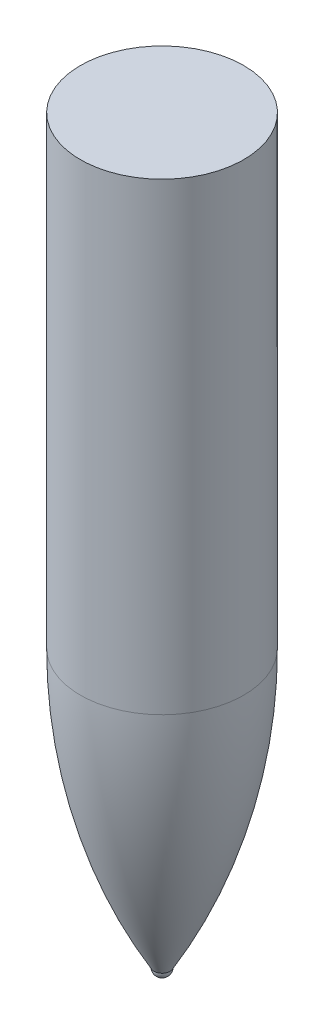
ISO-10303-21;
HEADER;
FILE_DESCRIPTION(('STEP AP214'),'2;1');
FILE_NAME('part.step','',(''),(''),'','','');
FILE_SCHEMA(('AUTOMOTIVE_DESIGN { 1 0 10303 214 1 1 1 1 }'));
ENDSEC;
DATA;
#1=APPLICATION_CONTEXT('core data for automotive mechanical design processes');
#2=APPLICATION_PROTOCOL_DEFINITION('international standard','automotive_design',2000,#1);
#3=PRODUCT_CONTEXT('',#1,'mechanical');
#4=PRODUCT('Part','Part','',(#3));
#5=PRODUCT_RELATED_PRODUCT_CATEGORY('part','',(#4));
#6=PRODUCT_DEFINITION_FORMATION('','',#4);
#7=PRODUCT_DEFINITION_CONTEXT('part definition',#1,'design');
#8=PRODUCT_DEFINITION('design','',#6,#7);
#9=PRODUCT_DEFINITION_SHAPE('','',#8);
#10=(LENGTH_UNIT() NAMED_UNIT(*) SI_UNIT(.MILLI.,.METRE.));
#11=(NAMED_UNIT(*) PLANE_ANGLE_UNIT() SI_UNIT($,.RADIAN.));
#12=(NAMED_UNIT(*) SI_UNIT($,.STERADIAN.) SOLID_ANGLE_UNIT());
#13=UNCERTAINTY_MEASURE_WITH_UNIT(LENGTH_MEASURE(1.E-05),#10,'distance_accuracy_value','');
#14=(GEOMETRIC_REPRESENTATION_CONTEXT(3) GLOBAL_UNCERTAINTY_ASSIGNED_CONTEXT((#13)) GLOBAL_UNIT_ASSIGNED_CONTEXT((#10,
#11,#12)) REPRESENTATION_CONTEXT('',''));
#15=CARTESIAN_POINT('',(0.,0.,0.));
#16=DIRECTION('',(0.,0.,1.));
#17=DIRECTION('',(1.,0.,0.));
#18=AXIS2_PLACEMENT_3D('',#15,#16,#17);
#19=CARTESIAN_POINT('',(0.,0.24256656090688,0.));
#20=DIRECTION('',(0.,-1.,0.));
#21=DIRECTION('',(-1.,0.,0.));
#22=AXIS2_PLACEMENT_3D('',#19,#20,#21);
#23=SPHERICAL_SURFACE('',#22,0.24256656090688);
#24=CARTESIAN_POINT('',(0.,0.242877763779445,0.));
#25=DIRECTION('',(0.,-1.,0.));
#26=DIRECTION('',(0.,0.,-1.));
#27=AXIS2_PLACEMENT_3D('',#24,#25,#26);
#28=CIRCLE('',#27,0.242566361276586);
#29=CARTESIAN_POINT('',(0.,0.242877763779445,-0.242566361276586));
#30=VERTEX_POINT('',#29);
#31=EDGE_CURVE('E41',#30,#30,#28,.T.);
#32=ORIENTED_EDGE('',*,*,#31,.T.);
#33=EDGE_LOOP('',(#32));
#34=FACE_BOUND('',#33,.T.);
#35=ADVANCED_FACE('F31',(#34),#23,.T.);
#36=CARTESIAN_POINT('',(-2.50000000000001,22.9,0.));
#37=DIRECTION('',(0.,-1.,0.));
#38=DIRECTION('',(0.,0.,-1.));
#39=AXIS2_PLACEMENT_3D('',#36,#37,#38);
#40=PLANE('',#39);
#41=CARTESIAN_POINT('',(0.,22.9,0.));
#42=DIRECTION('',(0.,-1.,0.));
#43=DIRECTION('',(0.,0.,-1.));
#44=AXIS2_PLACEMENT_3D('',#41,#42,#43);
#45=CIRCLE('',#44,2.50000000000001);
#46=CARTESIAN_POINT('',(0.,22.9,-2.50000000000001));
#47=VERTEX_POINT('',#46);
#48=EDGE_CURVE('E10',#47,#47,#45,.T.);
#49=ORIENTED_EDGE('',*,*,#48,.F.);
#50=EDGE_LOOP('',(#49));
#51=FACE_BOUND('',#50,.T.);
#52=ADVANCED_FACE('F56',(#51),#40,.F.);
#53=CARTESIAN_POINT('',(0.,0.,0.));
#54=DIRECTION('',(0.,-1.,0.));
#55=DIRECTION('',(0.,0.,-1.));
#56=AXIS2_PLACEMENT_3D('',#53,#54,#55);
#57=CYLINDRICAL_SURFACE('',#56,2.5);
#58=CARTESIAN_POINT('',(0.,8.69539903789215,0.));
#59=DIRECTION('',(0.,-1.,0.));
#60=DIRECTION('',(0.,0.,-1.));
#61=AXIS2_PLACEMENT_3D('',#58,#59,#60);
#62=CIRCLE('',#61,2.5);
#63=CARTESIAN_POINT('',(0.,8.69539903789215,-2.5));
#64=VERTEX_POINT('',#63);
#65=EDGE_CURVE('E37',#64,#64,#62,.T.);
#66=ORIENTED_EDGE('',*,*,#65,.F.);
#67=EDGE_LOOP('',(#66));
#68=FACE_BOUND('',#67,.T.);
#69=ORIENTED_EDGE('',*,*,#48,.T.);
#70=EDGE_LOOP('',(#69));
#71=FACE_BOUND('',#70,.T.);
#72=ADVANCED_FACE('F51',(#68,#71),#57,.T.);
#73=CARTESIAN_POINT('',(0.,8.69539903789215,0.));
#74=DIRECTION('',(0.,-1.,0.));
#75=DIRECTION('',(0.,0.,-1.));
#76=AXIS2_PLACEMENT_3D('',#73,#74,#75);
#77=DEGENERATE_TOROIDAL_SURFACE('',#76,14.4531279258008,16.9531279258008,.F.);
#78=ORIENTED_EDGE('',*,*,#31,.F.);
#79=EDGE_LOOP('',(#78));
#80=FACE_BOUND('',#79,.T.);
#81=ORIENTED_EDGE('',*,*,#65,.T.);
#82=EDGE_LOOP('',(#81));
#83=FACE_BOUND('',#82,.T.);
#84=ADVANCED_FACE('F49',(#80,#83),#77,.F.);
#85=CLOSED_SHELL('',(#35,#52,#72,#84));
#86=MANIFOLD_SOLID_BREP('B2',#85);
#87=ADVANCED_BREP_SHAPE_REPRESENTATION('',(#18,#86),#14);
#88=SHAPE_DEFINITION_REPRESENTATION(#9,#87);
ENDSEC;
END-ISO-10303-21;
